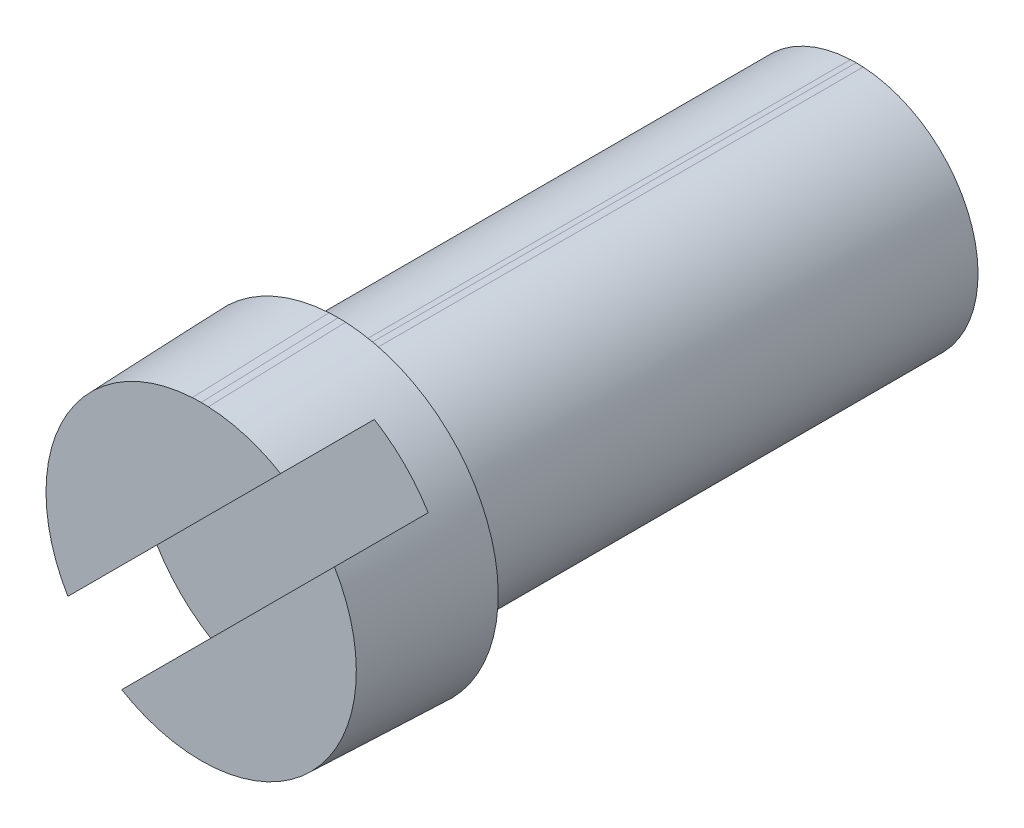
ISO-10303-21;
HEADER;
FILE_DESCRIPTION(('STEP AP214'),'2;1');
FILE_NAME('part.step','',(''),(''),'','','');
FILE_SCHEMA(('AUTOMOTIVE_DESIGN { 1 0 10303 214 1 1 1 1 }'));
ENDSEC;
DATA;
#1=APPLICATION_CONTEXT('core data for automotive mechanical design processes');
#2=APPLICATION_PROTOCOL_DEFINITION('international standard','automotive_design',2000,#1);
#3=PRODUCT_CONTEXT('',#1,'mechanical');
#4=PRODUCT('Part','Part','',(#3));
#5=PRODUCT_RELATED_PRODUCT_CATEGORY('part','',(#4));
#6=PRODUCT_DEFINITION_FORMATION('','',#4);
#7=PRODUCT_DEFINITION_CONTEXT('part definition',#1,'design');
#8=PRODUCT_DEFINITION('design','',#6,#7);
#9=PRODUCT_DEFINITION_SHAPE('','',#8);
#10=(LENGTH_UNIT() NAMED_UNIT(*) SI_UNIT(.MILLI.,.METRE.));
#11=(NAMED_UNIT(*) PLANE_ANGLE_UNIT() SI_UNIT($,.RADIAN.));
#12=(NAMED_UNIT(*) SI_UNIT($,.STERADIAN.) SOLID_ANGLE_UNIT());
#13=UNCERTAINTY_MEASURE_WITH_UNIT(LENGTH_MEASURE(1.E-05),#10,'distance_accuracy_value','');
#14=(GEOMETRIC_REPRESENTATION_CONTEXT(3) GLOBAL_UNCERTAINTY_ASSIGNED_CONTEXT((#13)) GLOBAL_UNIT_ASSIGNED_CONTEXT((#10,
#11,#12)) REPRESENTATION_CONTEXT('',''));
#15=CARTESIAN_POINT('',(0.,0.,0.));
#16=DIRECTION('',(0.,0.,1.));
#17=DIRECTION('',(1.,0.,0.));
#18=AXIS2_PLACEMENT_3D('',#15,#16,#17);
#19=CARTESIAN_POINT('',(11.61,3.05,6.77739939373157));
#20=DIRECTION('',(0.,0.,-1.));
#21=DIRECTION('',(-0.0575640269595673,0.998341816614028,0.));
#22=AXIS2_PLACEMENT_3D('',#19,#20,#21);
#23=CONICAL_SURFACE('',#22,1.05078923056187,0.0349065850398857);
#24=DIRECTION('',(-0.00200895556905843,0.0348416269368899,-0.999390827019096));
#25=VECTOR('',#24,1.);
#26=CARTESIAN_POINT('',(11.5495123404031,4.0990468293176,6.77739939373157));
#27=LINE('',#26,#25);
#28=CARTESIAN_POINT('',(11.5513669337973,4.06688232943797,7.7));
#29=VERTEX_POINT('',#28);
#30=CARTESIAN_POINT('',(11.5495577716925,4.09825890744473,6.8));
#31=VERTEX_POINT('',#30);
#32=EDGE_CURVE('E314',#29,#31,#27,.T.);
#33=ORIENTED_EDGE('',*,*,#32,.T.);
#34=CARTESIAN_POINT('',(11.61,3.05,6.8));
#35=DIRECTION('',(0.,0.,-1.));
#36=DIRECTION('',(0.,-1.,0.));
#37=AXIS2_PLACEMENT_3D('',#34,#35,#36);
#38=CIRCLE('',#37,1.05);
#39=CARTESIAN_POINT('',(11.61,2.,6.8));
#40=VERTEX_POINT('',#39);
#41=EDGE_CURVE('E242',#40,#31,#38,.T.);
#42=ORIENTED_EDGE('',*,*,#41,.F.);
#43=DIRECTION('',(0.,-0.034899496702501,-0.999390827019096));
#44=VECTOR('',#43,1.);
#45=CARTESIAN_POINT('',(11.61,2.03142869254257,7.7));
#46=LINE('',#45,#44);
#47=CARTESIAN_POINT('',(11.61,2.03142869254257,7.7));
#48=VERTEX_POINT('',#47);
#49=EDGE_CURVE('E191',#48,#40,#46,.T.);
#50=ORIENTED_EDGE('',*,*,#49,.F.);
#51=CARTESIAN_POINT('',(11.61,3.05,7.7));
#52=DIRECTION('',(0.,0.,1.));
#53=DIRECTION('',(-0.511923740970143,-0.85903089783263,0.));
#54=AXIS2_PLACEMENT_3D('',#51,#52,#53);
#55=CIRCLE('',#54,1.01857130745743);
#56=CARTESIAN_POINT('',(11.0885691658415,2.17501577524829,7.7));
#57=VERTEX_POINT('',#56);
#58=EDGE_CURVE('E215',#57,#48,#55,.T.);
#59=ORIENTED_EDGE('',*,*,#58,.F.);
#60=CARTESIAN_POINT('',(11.0732959083678,2.15974251777458,7.1));
#61=CARTESIAN_POINT('',(11.074567876733,2.16101448613971,7.15000004088115));
#62=CARTESIAN_POINT('',(11.075840041569,2.1622866509757,7.20000007176328));
#63=CARTESIAN_POINT('',(11.0771124060624,2.16355901546917,7.25000009248219));
#64=CARTESIAN_POINT('',(11.0783847705559,2.16483137996263,7.30000011320091));
#65=CARTESIAN_POINT('',(11.0796573347067,2.16610394411348,7.35000012375703));
#66=CARTESIAN_POINT('',(11.0809301017719,2.16737671117865,7.40000012398263));
#67=CARTESIAN_POINT('',(11.0822028688371,2.16864947824382,7.45000012420822));
#68=CARTESIAN_POINT('',(11.0834758388165,2.1699224482232,7.50000011410311));
#69=CARTESIAN_POINT('',(11.0847490150393,2.17119562444606,7.55000009349739));
#70=CARTESIAN_POINT('',(11.0853856031508,2.17183221255749,7.5750000831944));
#71=CARTESIAN_POINT('',(11.0860222428242,2.17246885223092,7.60000007026558));
#72=CARTESIAN_POINT('',(11.0866589344827,2.17310554388949,7.62500005469038));
#73=CARTESIAN_POINT('',(11.0872956261413,2.17374223554804,7.65000003911478));
#74=CARTESIAN_POINT('',(11.087932369785,2.17437897919169,7.6750000208918));
#75=CARTESIAN_POINT('',(11.0885691658415,2.17501577524827,7.7));
#76=(BOUNDED_CURVE() B_SPLINE_CURVE(3,(#60,#61,#62,#63,#64,#65,#66,#67,#68,#69,#70,#71,#72,#73,
#74,#75),.UNSPECIFIED.,.F.,.F.) B_SPLINE_CURVE_WITH_KNOTS((4,3,3,3,3,4),(0.,0.250000156767217,
0.49999992418636,0.749999626640853,0.8749998189346,0.999999999999803),
.UNSPECIFIED.) CURVE() GEOMETRIC_REPRESENTATION_ITEM() RATIONAL_B_SPLINE_CURVE((1.,1.,1.,1.,1.,
1.,1.,1.,1.,1.,1.,1.,1.,1.,1.,1.)) REPRESENTATION_ITEM(''));
#77=CARTESIAN_POINT('',(11.0732959083679,2.1597425177746,7.1));
#78=VERTEX_POINT('',#77);
#79=EDGE_CURVE('E203',#78,#57,#76,.T.);
#80=ORIENTED_EDGE('',*,*,#79,.F.);
#81=CARTESIAN_POINT('',(11.61,3.05,7.1));
#82=DIRECTION('',(0.,0.,-1.));
#83=DIRECTION('',(-0.516298046815895,-0.856408971726763,0.));
#84=AXIS2_PLACEMENT_3D('',#81,#82,#83);
#85=CIRCLE('',#84,1.03952376915248);
#86=CARTESIAN_POINT('',(10.7197425177746,2.51329590836787,7.1));
#87=VERTEX_POINT('',#86);
#88=EDGE_CURVE('E33',#78,#87,#85,.T.);
#89=ORIENTED_EDGE('',*,*,#88,.T.);
#90=CARTESIAN_POINT('',(10.7350157752482,2.52856916584139,7.7));
#91=CARTESIAN_POINT('',(10.7337421831377,2.52729557373092,7.65000004188913));
#92=CARTESIAN_POINT('',(10.7324688006735,2.52602219126672,7.60000007307481));
#93=CARTESIAN_POINT('',(10.731195624452,2.52474901504519,7.55000009373329));
#94=CARTESIAN_POINT('',(10.7299224482305,2.52347583882367,7.50000011439166));
#95=CARTESIAN_POINT('',(10.7286494782517,2.52220286884495,7.45000012452239));
#96=CARTESIAN_POINT('',(10.7273767111866,2.52093010177977,7.40000012429663));
#97=CARTESIAN_POINT('',(10.7261039441214,2.5196573347146,7.35000012407097));
#98=CARTESIAN_POINT('',(10.7248313799699,2.51838477056309,7.30000011348838));
#99=CARTESIAN_POINT('',(10.7235590154751,2.51711240606829,7.25000009271748));
#100=CARTESIAN_POINT('',(10.7222866509803,2.51584004157349,7.20000007194621));
#101=CARTESIAN_POINT('',(10.7210144861423,2.51456787673551,7.15000004098542));
#102=CARTESIAN_POINT('',(10.7197425177745,2.51329590836772,7.1));
#103=(BOUNDED_CURVE() B_SPLINE_CURVE(3,(#90,#91,#92,#93,#94,#95,#96,#97,#98,#99,#100,#101,#102),
.UNSPECIFIED.,.F.,.F.) B_SPLINE_CURVE_WITH_KNOTS((4,3,3,3,4),(0.,0.249999786876802,
0.499999825325859,0.749999935575939,1.00000000000028),
.UNSPECIFIED.) CURVE() GEOMETRIC_REPRESENTATION_ITEM() RATIONAL_B_SPLINE_CURVE((1.,1.,1.,1.,1.,
1.,1.,1.,1.,1.,1.,1.,1.)) REPRESENTATION_ITEM(''));
#104=CARTESIAN_POINT('',(10.7350157752483,2.52856916584148,7.7));
#105=VERTEX_POINT('',#104);
#106=EDGE_CURVE('E229',#105,#87,#103,.T.);
#107=ORIENTED_EDGE('',*,*,#106,.F.);
#108=CARTESIAN_POINT('',(11.61,3.05,7.7));
#109=DIRECTION('',(0.,0.,1.));
#110=DIRECTION('',(0.,1.,0.));
#111=AXIS2_PLACEMENT_3D('',#108,#109,#110);
#112=CIRCLE('',#111,1.01857130745743);
#113=EDGE_CURVE('E117',#29,#105,#112,.T.);
#114=ORIENTED_EDGE('',*,*,#113,.F.);
#115=EDGE_LOOP('',(#33,#42,#50,#59,#80,#89,#107,#114));
#116=FACE_BOUND('',#115,.T.);
#117=ADVANCED_FACE('F16',(#116),#23,.T.);
#118=CARTESIAN_POINT('',(11.61,3.05,6.88500393750001));
#119=DIRECTION('',(0.,0.,-1.));
#120=DIRECTION('',(0.057564026959567,0.998341816614028,0.));
#121=AXIS2_PLACEMENT_3D('',#118,#119,#120);
#122=CYLINDRICAL_SURFACE('',#121,0.8);
#123=DIRECTION('',(0.,0.,-1.));
#124=VECTOR('',#123,1.);
#125=CARTESIAN_POINT('',(11.6560512215677,3.84867345329122,5.1));
#126=LINE('',#125,#124);
#127=CARTESIAN_POINT('',(11.6560512215677,3.84867345329122,6.8));
#128=VERTEX_POINT('',#127);
#129=CARTESIAN_POINT('',(11.6560512215677,3.84867345329122,3.4));
#130=VERTEX_POINT('',#129);
#131=EDGE_CURVE('E148',#128,#130,#126,.T.);
#132=ORIENTED_EDGE('',*,*,#131,.T.);
#133=CARTESIAN_POINT('',(11.61,3.05,3.4));
#134=DIRECTION('',(0.,0.,-1.));
#135=DIRECTION('',(0.,1.,0.));
#136=AXIS2_PLACEMENT_3D('',#133,#134,#135);
#137=CIRCLE('',#136,0.8);
#138=CARTESIAN_POINT('',(11.61,3.85,3.4));
#139=VERTEX_POINT('',#138);
#140=EDGE_CURVE('E11',#139,#130,#137,.T.);
#141=ORIENTED_EDGE('',*,*,#140,.F.);
#142=DIRECTION('',(0.,0.,-1.));
#143=VECTOR('',#142,1.);
#144=CARTESIAN_POINT('',(11.61,3.85,6.8));
#145=LINE('',#144,#143);
#146=CARTESIAN_POINT('',(11.61,3.85,6.8));
#147=VERTEX_POINT('',#146);
#148=EDGE_CURVE('E116',#147,#139,#145,.T.);
#149=ORIENTED_EDGE('',*,*,#148,.F.);
#150=CARTESIAN_POINT('',(11.61,3.05,6.8));
#151=DIRECTION('',(0.,0.,-1.));
#152=DIRECTION('',(0.,1.,0.));
#153=AXIS2_PLACEMENT_3D('',#150,#151,#152);
#154=CIRCLE('',#153,0.8);
#155=EDGE_CURVE('E20',#147,#128,#154,.T.);
#156=ORIENTED_EDGE('',*,*,#155,.T.);
#157=EDGE_LOOP('',(#132,#141,#149,#156));
#158=FACE_BOUND('',#157,.T.);
#159=ADVANCED_FACE('F18',(#158),#122,.T.);
#160=CARTESIAN_POINT('',(10.76999685,2.20999685,3.4));
#161=DIRECTION('',(0.,0.,-1.));
#162=DIRECTION('',(0.,-1.,0.));
#163=AXIS2_PLACEMENT_3D('',#160,#161,#162);
#164=PLANE('',#163);
#165=CARTESIAN_POINT('',(11.61,3.05,3.4));
#166=DIRECTION('',(0.,0.,-1.));
#167=DIRECTION('',(0.,-1.,0.));
#168=AXIS2_PLACEMENT_3D('',#165,#166,#167);
#169=CIRCLE('',#168,0.8);
#170=CARTESIAN_POINT('',(11.61,2.25,3.4));
#171=VERTEX_POINT('',#170);
#172=CARTESIAN_POINT('',(11.5730261327257,3.84914512645625,3.4));
#173=VERTEX_POINT('',#172);
#174=EDGE_CURVE('E128',#171,#173,#169,.T.);
#175=ORIENTED_EDGE('',*,*,#174,.T.);
#176=CARTESIAN_POINT('',(11.61,3.05,3.4));
#177=DIRECTION('',(0.,0.,-1.));
#178=DIRECTION('',(0.,-1.,0.));
#179=AXIS2_PLACEMENT_3D('',#176,#177,#178);
#180=CIRCLE('',#179,0.8);
#181=EDGE_CURVE('E131',#173,#139,#180,.T.);
#182=ORIENTED_EDGE('',*,*,#181,.T.);
#183=ORIENTED_EDGE('',*,*,#140,.T.);
#184=CARTESIAN_POINT('',(11.61,3.05,3.4));
#185=DIRECTION('',(0.,0.,-1.));
#186=DIRECTION('',(0.,1.,0.));
#187=AXIS2_PLACEMENT_3D('',#184,#185,#186);
#188=CIRCLE('',#187,0.8);
#189=EDGE_CURVE('E133',#130,#171,#188,.T.);
#190=ORIENTED_EDGE('',*,*,#189,.T.);
#191=EDGE_LOOP('',(#175,#182,#183,#190));
#192=FACE_BOUND('',#191,.T.);
#193=ADVANCED_FACE('F256',(#192),#164,.T.);
#194=CARTESIAN_POINT('',(10.50749685,1.94749685,6.8));
#195=DIRECTION('',(0.,0.,-1.));
#196=DIRECTION('',(0.,-1.,0.));
#197=AXIS2_PLACEMENT_3D('',#194,#195,#196);
#198=PLANE('',#197);
#199=CARTESIAN_POINT('',(11.61,3.05,6.8));
#200=DIRECTION('',(0.,0.,-1.));
#201=DIRECTION('',(0.,-1.,0.));
#202=AXIS2_PLACEMENT_3D('',#199,#200,#201);
#203=CIRCLE('',#202,0.8);
#204=CARTESIAN_POINT('',(11.61,2.25,6.8));
#205=VERTEX_POINT('',#204);
#206=CARTESIAN_POINT('',(11.5730261327257,3.84914512645625,6.8));
#207=VERTEX_POINT('',#206);
#208=EDGE_CURVE('E110',#205,#207,#203,.T.);
#209=ORIENTED_EDGE('',*,*,#208,.F.);
#210=CARTESIAN_POINT('',(11.61,3.05,6.8));
#211=DIRECTION('',(0.,0.,-1.));
#212=DIRECTION('',(0.,1.,0.));
#213=AXIS2_PLACEMENT_3D('',#210,#211,#212);
#214=CIRCLE('',#213,0.8);
#215=EDGE_CURVE('E150',#128,#205,#214,.T.);
#216=ORIENTED_EDGE('',*,*,#215,.F.);
#217=ORIENTED_EDGE('',*,*,#155,.F.);
#218=CARTESIAN_POINT('',(11.61,3.05,6.8));
#219=DIRECTION('',(0.,0.,-1.));
#220=DIRECTION('',(0.,-1.,0.));
#221=AXIS2_PLACEMENT_3D('',#218,#219,#220);
#222=CIRCLE('',#221,0.8);
#223=EDGE_CURVE('E105',#207,#147,#222,.T.);
#224=ORIENTED_EDGE('',*,*,#223,.F.);
#225=EDGE_LOOP('',(#209,#216,#217,#224));
#226=FACE_BOUND('',#225,.T.);
#227=ORIENTED_EDGE('',*,*,#41,.T.);
#228=CARTESIAN_POINT('',(11.61,3.05,6.8));
#229=DIRECTION('',(0.,0.,-1.));
#230=DIRECTION('',(0.,-1.,0.));
#231=AXIS2_PLACEMENT_3D('',#228,#229,#230);
#232=CIRCLE('',#231,1.05);
#233=CARTESIAN_POINT('',(11.61,4.1,6.8));
#234=VERTEX_POINT('',#233);
#235=EDGE_CURVE('E144',#31,#234,#232,.T.);
#236=ORIENTED_EDGE('',*,*,#235,.T.);
#237=CARTESIAN_POINT('',(11.61,3.05,6.8));
#238=DIRECTION('',(0.,0.,-1.));
#239=DIRECTION('',(0.,1.,0.));
#240=AXIS2_PLACEMENT_3D('',#237,#238,#239);
#241=CIRCLE('',#240,1.05);
#242=CARTESIAN_POINT('',(11.6585282007976,4.09887797847383,6.8));
#243=VERTEX_POINT('',#242);
#244=EDGE_CURVE('E170',#234,#243,#241,.T.);
#245=ORIENTED_EDGE('',*,*,#244,.T.);
#246=CARTESIAN_POINT('',(11.61,3.05,6.8));
#247=DIRECTION('',(0.,0.,-1.));
#248=DIRECTION('',(0.,1.,0.));
#249=AXIS2_PLACEMENT_3D('',#246,#247,#248);
#250=CIRCLE('',#249,1.05);
#251=EDGE_CURVE('E195',#243,#40,#250,.T.);
#252=ORIENTED_EDGE('',*,*,#251,.T.);
#253=EDGE_LOOP('',(#227,#236,#245,#252));
#254=FACE_BOUND('',#253,.T.);
#255=ADVANCED_FACE('F107',(#226,#254),#198,.T.);
#256=CARTESIAN_POINT('',(11.0238085083705,2.09257299347488,7.1));
#257=DIRECTION('',(0.,0.,-1.));
#258=DIRECTION('',(0.,-1.,0.));
#259=AXIS2_PLACEMENT_3D('',#256,#257,#258);
#260=PLANE('',#259);
#261=CARTESIAN_POINT('',(11.61,3.05,7.1));
#262=DIRECTION('',(0.,0.,-1.));
#263=DIRECTION('',(0.516298046815895,0.856408971726763,0.));
#264=AXIS2_PLACEMENT_3D('',#261,#262,#263);
#265=CIRCLE('',#264,1.03952376915248);
#266=CARTESIAN_POINT('',(12.1467040916321,3.9402574822254,7.1));
#267=VERTEX_POINT('',#266);
#268=CARTESIAN_POINT('',(12.5002574822254,3.58670409163212,7.1));
#269=VERTEX_POINT('',#268);
#270=EDGE_CURVE('E159',#267,#269,#265,.T.);
#271=ORIENTED_EDGE('',*,*,#270,.F.);
#272=DIRECTION('',(-0.707106781186548,-0.707106781186547,0.));
#273=VECTOR('',#272,1.);
#274=CARTESIAN_POINT('',(12.1467040916321,3.94025748222539,7.1));
#275=LINE('',#274,#273);
#276=EDGE_CURVE('E235',#267,#87,#275,.T.);
#277=ORIENTED_EDGE('',*,*,#276,.T.);
#278=ORIENTED_EDGE('',*,*,#88,.F.);
#279=DIRECTION('',(-0.707106781186548,-0.707106781186547,0.));
#280=VECTOR('',#279,1.);
#281=CARTESIAN_POINT('',(12.5002574822254,3.58670409163211,7.1));
#282=LINE('',#281,#280);
#283=EDGE_CURVE('E199',#269,#78,#282,.T.);
#284=ORIENTED_EDGE('',*,*,#283,.F.);
#285=EDGE_LOOP('',(#271,#277,#278,#284));
#286=FACE_BOUND('',#285,.T.);
#287=ADVANCED_FACE('F263',(#286),#260,.F.);
#288=CARTESIAN_POINT('',(10.6840654073501,2.47761879794335,7.08499565590106));
#289=DIRECTION('',(-0.707106781186547,0.707106781186548,0.));
#290=DIRECTION('',(0.,0.,1.));
#291=AXIS2_PLACEMENT_3D('',#288,#289,#290);
#292=PLANE('',#291);
#293=DIRECTION('',(-0.707106781186548,-0.707106781186547,0.));
#294=VECTOR('',#293,1.);
#295=CARTESIAN_POINT('',(12.1314308341584,3.92498422475172,7.7));
#296=LINE('',#295,#294);
#297=CARTESIAN_POINT('',(12.1314308341584,3.92498422475172,7.7));
#298=VERTEX_POINT('',#297);
#299=EDGE_CURVE('E218',#298,#105,#296,.T.);
#300=ORIENTED_EDGE('',*,*,#299,.T.);
#301=ORIENTED_EDGE('',*,*,#106,.T.);
#302=ORIENTED_EDGE('',*,*,#276,.F.);
#303=CARTESIAN_POINT('',(12.1467040916321,3.9402574822254,7.1));
#304=CARTESIAN_POINT('',(12.1454321232861,3.93898551387933,7.15000004013163));
#305=CARTESIAN_POINT('',(12.1441599584681,3.9377133490614,7.20000007030441));
#306=CARTESIAN_POINT('',(12.1428875939917,3.93644098458499,7.25000009035277));
#307=CARTESIAN_POINT('',(12.1416152295153,3.9351686201086,7.30000011040077));
#308=CARTESIAN_POINT('',(12.1403426653806,3.93389605597384,7.35000012032556));
#309=CARTESIAN_POINT('',(12.1390698983305,3.93262328892378,7.4000001199579));
#310=CARTESIAN_POINT('',(12.1377971312816,3.9313505218749,7.45000011954369));
#311=CARTESIAN_POINT('',(12.1365241613173,3.93007755191058,7.50000010884817));
#312=CARTESIAN_POINT('',(12.1352509850756,3.92880437566886,7.55000008898344));
#313=CARTESIAN_POINT('',(12.1339778088365,3.92753119942975,7.60000006901616));
#314=CARTESIAN_POINT('',(12.1327044263316,3.92625781692486,7.65000003942837));
#315=CARTESIAN_POINT('',(12.1314308341584,3.92498422475172,7.7));
#316=(BOUNDED_CURVE() B_SPLINE_CURVE(3,(#303,#304,#305,#306,#307,#308,#309,#310,#311,#312,#313,
#314,#315),.UNSPECIFIED.,.F.,.F.) B_SPLINE_CURVE_WITH_KNOTS((4,3,3,3,4),(1.98103503507076E-13,
0.25000028372254,0.500000178151361,0.75000021489113,0.999999999999935),
.UNSPECIFIED.) CURVE() GEOMETRIC_REPRESENTATION_ITEM() RATIONAL_B_SPLINE_CURVE((1.,1.,1.,1.,1.,
1.,1.,1.,1.,1.,1.,1.,1.)) REPRESENTATION_ITEM(''));
#317=EDGE_CURVE('E153',#267,#298,#316,.T.);
#318=ORIENTED_EDGE('',*,*,#317,.T.);
#319=EDGE_LOOP('',(#300,#301,#302,#318));
#320=FACE_BOUND('',#319,.T.);
#321=ADVANCED_FACE('F292',(#320),#292,.F.);
#322=CARTESIAN_POINT('',(11.61,3.05,6.88500393750001));
#323=DIRECTION('',(0.,0.,-1.));
#324=DIRECTION('',(0.0462173340929395,-0.998931408070315,0.));
#325=AXIS2_PLACEMENT_3D('',#322,#323,#324);
#326=CYLINDRICAL_SURFACE('',#325,0.8);
#327=DIRECTION('',(0.,0.,1.));
#328=VECTOR('',#327,1.);
#329=CARTESIAN_POINT('',(11.5730261327257,3.84914512645625,5.1));
#330=LINE('',#329,#328);
#331=EDGE_CURVE('E122',#173,#207,#330,.T.);
#332=ORIENTED_EDGE('',*,*,#331,.T.);
#333=ORIENTED_EDGE('',*,*,#223,.T.);
#334=ORIENTED_EDGE('',*,*,#148,.T.);
#335=ORIENTED_EDGE('',*,*,#181,.F.);
#336=EDGE_LOOP('',(#332,#333,#334,#335));
#337=FACE_BOUND('',#336,.T.);
#338=ADVANCED_FACE('F130',(#337),#326,.T.);
#339=CARTESIAN_POINT('',(10.2615728987039,4.22257152161902,7.7));
#340=DIRECTION('',(0.,0.,1.));
#341=DIRECTION('',(1.,0.,0.));
#342=AXIS2_PLACEMENT_3D('',#339,#340,#341);
#343=PLANE('',#342);
#344=ORIENTED_EDGE('',*,*,#299,.F.);
#345=CARTESIAN_POINT('',(11.61,3.05,7.7));
#346=DIRECTION('',(0.,0.,1.));
#347=DIRECTION('',(0.511923740970131,0.859030897832637,0.));
#348=AXIS2_PLACEMENT_3D('',#345,#346,#347);
#349=CIRCLE('',#348,1.01857130745743);
#350=CARTESIAN_POINT('',(11.6570756504142,4.06748287037847,7.7));
#351=VERTEX_POINT('',#350);
#352=EDGE_CURVE('E160',#298,#351,#349,.T.);
#353=ORIENTED_EDGE('',*,*,#352,.T.);
#354=CARTESIAN_POINT('',(11.61,3.05,7.7));
#355=DIRECTION('',(0.,0.,1.));
#356=DIRECTION('',(0.511923740970131,0.859030897832637,0.));
#357=AXIS2_PLACEMENT_3D('',#354,#355,#356);
#358=CIRCLE('',#357,1.01857130745743);
#359=CARTESIAN_POINT('',(11.61,4.06857130745743,7.7));
#360=VERTEX_POINT('',#359);
#361=EDGE_CURVE('E167',#351,#360,#358,.T.);
#362=ORIENTED_EDGE('',*,*,#361,.T.);
#363=CARTESIAN_POINT('',(11.61,3.05,7.7));
#364=DIRECTION('',(0.,0.,1.));
#365=DIRECTION('',(0.,1.,0.));
#366=AXIS2_PLACEMENT_3D('',#363,#364,#365);
#367=CIRCLE('',#366,1.01857130745743);
#368=EDGE_CURVE('E307',#360,#29,#367,.T.);
#369=ORIENTED_EDGE('',*,*,#368,.T.);
#370=ORIENTED_EDGE('',*,*,#113,.T.);
#371=EDGE_LOOP('',(#344,#353,#362,#369,#370));
#372=FACE_BOUND('',#371,.T.);
#373=ADVANCED_FACE('F289',(#372),#343,.T.);
#374=CARTESIAN_POINT('',(10.9185820808002,3.72543104832006,7.7));
#375=DIRECTION('',(0.,0.,1.));
#376=DIRECTION('',(1.,0.,0.));
#377=AXIS2_PLACEMENT_3D('',#374,#375,#376);
#378=PLANE('',#377);
#379=DIRECTION('',(0.707106781186548,0.707106781186547,0.));
#380=VECTOR('',#379,1.);
#381=CARTESIAN_POINT('',(11.0885691658415,2.17501577524824,7.7));
#382=LINE('',#381,#380);
#383=CARTESIAN_POINT('',(12.4849842247516,3.57143083415858,7.7));
#384=VERTEX_POINT('',#383);
#385=EDGE_CURVE('E209',#57,#384,#382,.T.);
#386=ORIENTED_EDGE('',*,*,#385,.F.);
#387=ORIENTED_EDGE('',*,*,#58,.T.);
#388=CARTESIAN_POINT('',(11.61,3.05,7.7));
#389=DIRECTION('',(0.,0.,1.));
#390=DIRECTION('',(0.,-1.,0.));
#391=AXIS2_PLACEMENT_3D('',#388,#389,#390);
#392=CIRCLE('',#391,1.01857130745743);
#393=EDGE_CURVE('E184',#48,#384,#392,.T.);
#394=ORIENTED_EDGE('',*,*,#393,.T.);
#395=EDGE_LOOP('',(#386,#387,#394));
#396=FACE_BOUND('',#395,.T.);
#397=ADVANCED_FACE('F285',(#396),#378,.T.);
#398=CARTESIAN_POINT('',(11.0376187979435,2.12406540735026,7.71500438165804));
#399=DIRECTION('',(0.707106781186547,-0.707106781186548,0.));
#400=DIRECTION('',(0.,0.,-1.));
#401=AXIS2_PLACEMENT_3D('',#398,#399,#400);
#402=PLANE('',#401);
#403=CARTESIAN_POINT('',(12.4849842247519,3.57143083415875,7.7));
#404=CARTESIAN_POINT('',(12.4856210208064,3.57206763021325,7.67500002097333));
#405=CARTESIAN_POINT('',(12.4862577644482,3.57270437385508,7.6500000392676));
#406=CARTESIAN_POINT('',(12.4868944561052,3.57334106551208,7.62500005490421));
#407=CARTESIAN_POINT('',(12.4875311477622,3.57397775716907,7.60000007054087));
#408=CARTESIAN_POINT('',(12.4881677874344,3.57461439684122,7.57500008352008));
#409=CARTESIAN_POINT('',(12.4888043755448,3.57525098495161,7.55000009386364));
#410=CARTESIAN_POINT('',(12.4900775517656,3.57652416117241,7.50000011455076));
#411=CARTESIAN_POINT('',(12.4913505217439,3.57779713115076,7.45000012469551));
#412=CARTESIAN_POINT('',(12.4926232888091,3.57906989821595,7.40000012446936));
#413=CARTESIAN_POINT('',(12.4938960558743,3.58034266528114,7.35000012424322));
#414=CARTESIAN_POINT('',(12.4951686200262,3.58161522943301,7.30000011364618));
#415=CARTESIAN_POINT('',(12.4964409845217,3.58288759392855,7.25000009284599));
#416=CARTESIAN_POINT('',(12.4970771667695,3.58352377617632,7.2250000824459));
#417=CARTESIAN_POINT('',(12.4977132991021,3.58415990850888,7.20000006949495));
#418=CARTESIAN_POINT('',(12.4983493819199,3.58479599132674,7.1750000540138));
#419=CARTESIAN_POINT('',(12.4989854647378,3.58543207414461,7.15000003853259));
#420=CARTESIAN_POINT('',(12.4996214980409,3.58606810744776,7.12500002052138));
#421=CARTESIAN_POINT('',(12.5002574822256,3.58670409163238,7.1));
#422=(BOUNDED_CURVE() B_SPLINE_CURVE(3,(#403,#404,#405,#406,#407,#408,#409,#410,#411,#412,#413,
#414,#415,#416,#417,#418,#419,#420,#421),.UNSPECIFIED.,.F.,.F.) B_SPLINE_CURVE_WITH_KNOTS((4,3,
3,3,3,3,4),(1.7293297700959E-13,0.124999920268788,0.250000249673972,0.500000433590307,
0.750000261149083,0.874999906584595,0.999999999999828),
.UNSPECIFIED.) CURVE() GEOMETRIC_REPRESENTATION_ITEM() RATIONAL_B_SPLINE_CURVE((1.,1.,1.,1.,1.,
1.,1.,1.,1.,1.,1.,1.,1.,1.,1.,1.,1.,1.,1.)) REPRESENTATION_ITEM(''));
#423=EDGE_CURVE('E178',#384,#269,#422,.T.);
#424=ORIENTED_EDGE('',*,*,#423,.T.);
#425=ORIENTED_EDGE('',*,*,#283,.T.);
#426=ORIENTED_EDGE('',*,*,#79,.T.);
#427=ORIENTED_EDGE('',*,*,#385,.T.);
#428=EDGE_LOOP('',(#424,#425,#426,#427));
#429=FACE_BOUND('',#428,.T.);
#430=ADVANCED_FACE('F281',(#429),#402,.F.);
#431=CARTESIAN_POINT('',(11.61,3.05,6.77739939373118));
#432=DIRECTION('',(0.,0.,-1.));
#433=DIRECTION('',(-0.0462173340929383,-0.998931408070315,0.));
#434=AXIS2_PLACEMENT_3D('',#431,#432,#433);
#435=CONICAL_SURFACE('',#434,1.05078923056189,0.0349065850398889);
#436=DIRECTION('',(-0.00161296169877406,-0.0348622033819761,0.999390827019096));
#437=VECTOR('',#436,1.);
#438=CARTESIAN_POINT('',(11.6585646769301,4.09966636567031,6.77739939373118));
#439=LINE('',#438,#437);
#440=EDGE_CURVE('E127',#243,#351,#439,.T.);
#441=ORIENTED_EDGE('',*,*,#440,.T.);
#442=ORIENTED_EDGE('',*,*,#352,.F.);
#443=ORIENTED_EDGE('',*,*,#317,.F.);
#444=ORIENTED_EDGE('',*,*,#270,.T.);
#445=ORIENTED_EDGE('',*,*,#423,.F.);
#446=ORIENTED_EDGE('',*,*,#393,.F.);
#447=ORIENTED_EDGE('',*,*,#49,.T.);
#448=ORIENTED_EDGE('',*,*,#251,.F.);
#449=EDGE_LOOP('',(#441,#442,#443,#444,#445,#446,#447,#448));
#450=FACE_BOUND('',#449,.T.);
#451=ADVANCED_FACE('F277',(#450),#435,.T.);
#452=CARTESIAN_POINT('',(11.61,3.05,6.77739939373118));
#453=DIRECTION('',(0.,0.,-1.));
#454=DIRECTION('',(-0.0462173340929383,-0.998931408070315,0.));
#455=AXIS2_PLACEMENT_3D('',#452,#453,#454);
#456=CONICAL_SURFACE('',#455,1.05078923056189,0.0349065850398889);
#457=ORIENTED_EDGE('',*,*,#440,.F.);
#458=ORIENTED_EDGE('',*,*,#244,.F.);
#459=DIRECTION('',(0.,0.034899496702501,-0.999390827019096));
#460=VECTOR('',#459,1.);
#461=CARTESIAN_POINT('',(11.61,4.06857130745743,7.7));
#462=LINE('',#461,#460);
#463=EDGE_CURVE('E142',#360,#234,#462,.T.);
#464=ORIENTED_EDGE('',*,*,#463,.F.);
#465=ORIENTED_EDGE('',*,*,#361,.F.);
#466=EDGE_LOOP('',(#457,#458,#464,#465));
#467=FACE_BOUND('',#466,.T.);
#468=ADVANCED_FACE('F274',(#467),#456,.T.);
#469=CARTESIAN_POINT('',(11.61,3.05,6.88500393750001));
#470=DIRECTION('',(0.,0.,-1.));
#471=DIRECTION('',(0.0462173340929395,-0.998931408070315,0.));
#472=AXIS2_PLACEMENT_3D('',#469,#470,#471);
#473=CYLINDRICAL_SURFACE('',#472,0.8);
#474=ORIENTED_EDGE('',*,*,#331,.F.);
#475=ORIENTED_EDGE('',*,*,#174,.F.);
#476=DIRECTION('',(0.,0.,-1.));
#477=VECTOR('',#476,1.);
#478=CARTESIAN_POINT('',(11.61,2.25,6.8));
#479=LINE('',#478,#477);
#480=EDGE_CURVE('E124',#205,#171,#479,.T.);
#481=ORIENTED_EDGE('',*,*,#480,.F.);
#482=ORIENTED_EDGE('',*,*,#208,.T.);
#483=EDGE_LOOP('',(#474,#475,#481,#482));
#484=FACE_BOUND('',#483,.T.);
#485=ADVANCED_FACE('F121',(#484),#473,.T.);
#486=CARTESIAN_POINT('',(11.61,3.05,6.88500393750001));
#487=DIRECTION('',(0.,0.,-1.));
#488=DIRECTION('',(0.057564026959567,0.998341816614028,0.));
#489=AXIS2_PLACEMENT_3D('',#486,#487,#488);
#490=CYLINDRICAL_SURFACE('',#489,0.8);
#491=ORIENTED_EDGE('',*,*,#131,.F.);
#492=ORIENTED_EDGE('',*,*,#215,.T.);
#493=ORIENTED_EDGE('',*,*,#480,.T.);
#494=ORIENTED_EDGE('',*,*,#189,.F.);
#495=EDGE_LOOP('',(#491,#492,#493,#494));
#496=FACE_BOUND('',#495,.T.);
#497=ADVANCED_FACE('F254',(#496),#490,.T.);
#498=CARTESIAN_POINT('',(11.61,3.05,6.77739939373157));
#499=DIRECTION('',(0.,0.,-1.));
#500=DIRECTION('',(-0.0575640269595673,0.998341816614028,0.));
#501=AXIS2_PLACEMENT_3D('',#498,#499,#500);
#502=CONICAL_SURFACE('',#501,1.05078923056187,0.0349065850398857);
#503=ORIENTED_EDGE('',*,*,#32,.F.);
#504=ORIENTED_EDGE('',*,*,#368,.F.);
#505=ORIENTED_EDGE('',*,*,#463,.T.);
#506=ORIENTED_EDGE('',*,*,#235,.F.);
#507=EDGE_LOOP('',(#503,#504,#505,#506));
#508=FACE_BOUND('',#507,.T.);
#509=ADVANCED_FACE('F315',(#508),#502,.T.);
#510=CLOSED_SHELL('',(#117,#159,#193,#255,#287,#321,#338,#373,#397,#430,#451,#468,#485,#497,#509));
#511=MANIFOLD_SOLID_BREP('B1',#510);
#512=ADVANCED_BREP_SHAPE_REPRESENTATION('',(#18,#511),#14);
#513=SHAPE_DEFINITION_REPRESENTATION(#9,#512);
ENDSEC;
END-ISO-10303-21;
